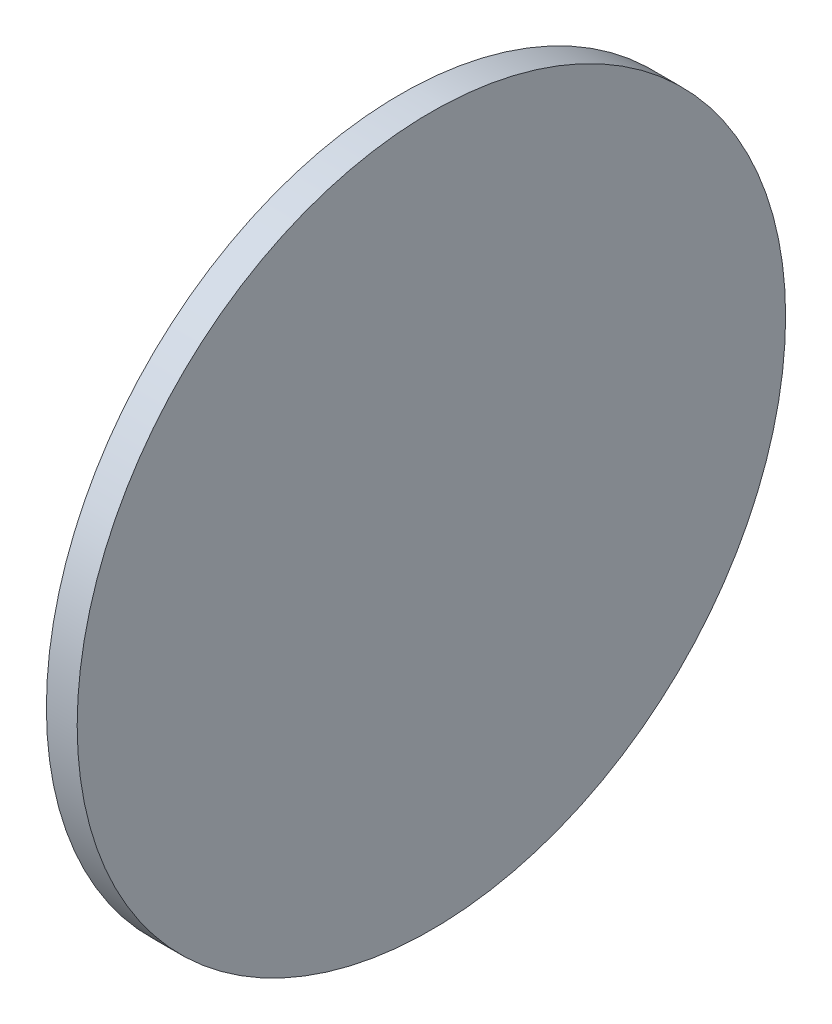
ISO-10303-21;
HEADER;
FILE_DESCRIPTION(('STEP AP214'),'2;1');
FILE_NAME('part.step','',(''),(''),'','','');
FILE_SCHEMA(('AUTOMOTIVE_DESIGN { 1 0 10303 214 1 1 1 1 }'));
ENDSEC;
DATA;
#1=APPLICATION_CONTEXT('core data for automotive mechanical design processes');
#2=APPLICATION_PROTOCOL_DEFINITION('international standard','automotive_design',2000,#1);
#3=PRODUCT_CONTEXT('',#1,'mechanical');
#4=PRODUCT('Part','Part','',(#3));
#5=PRODUCT_RELATED_PRODUCT_CATEGORY('part','',(#4));
#6=PRODUCT_DEFINITION_FORMATION('','',#4);
#7=PRODUCT_DEFINITION_CONTEXT('part definition',#1,'design');
#8=PRODUCT_DEFINITION('design','',#6,#7);
#9=PRODUCT_DEFINITION_SHAPE('','',#8);
#10=(LENGTH_UNIT() NAMED_UNIT(*) SI_UNIT(.MILLI.,.METRE.));
#11=(NAMED_UNIT(*) PLANE_ANGLE_UNIT() SI_UNIT($,.RADIAN.));
#12=(NAMED_UNIT(*) SI_UNIT($,.STERADIAN.) SOLID_ANGLE_UNIT());
#13=UNCERTAINTY_MEASURE_WITH_UNIT(LENGTH_MEASURE(1.E-05),#10,'distance_accuracy_value','');
#14=(GEOMETRIC_REPRESENTATION_CONTEXT(3) GLOBAL_UNCERTAINTY_ASSIGNED_CONTEXT((#13)) GLOBAL_UNIT_ASSIGNED_CONTEXT((#10,
#11,#12)) REPRESENTATION_CONTEXT('',''));
#15=CARTESIAN_POINT('',(0.,0.,0.));
#16=DIRECTION('',(0.,0.,1.));
#17=DIRECTION('',(1.,0.,0.));
#18=AXIS2_PLACEMENT_3D('',#15,#16,#17);
#19=CARTESIAN_POINT('',(0.,0.,0.));
#20=DIRECTION('',(1.,0.,0.));
#21=DIRECTION('',(0.,0.,-1.));
#22=AXIS2_PLACEMENT_3D('',#19,#20,#21);
#23=PLANE('',#22);
#24=CARTESIAN_POINT('',(0.,0.,0.));
#25=DIRECTION('',(-1.,0.,0.));
#26=DIRECTION('',(0.,0.,1.));
#27=AXIS2_PLACEMENT_3D('',#24,#25,#26);
#28=CIRCLE('',#27,1.4605);
#29=CARTESIAN_POINT('',(0.,0.,1.4605));
#30=VERTEX_POINT('',#29);
#31=EDGE_CURVE('E18',#30,#30,#28,.F.);
#32=ORIENTED_EDGE('',*,*,#31,.F.);
#33=EDGE_LOOP('',(#32));
#34=FACE_BOUND('',#33,.T.);
#35=ADVANCED_FACE('F15',(#34),#23,.F.);
#36=CARTESIAN_POINT('',(0.127,0.,0.));
#37=DIRECTION('',(-1.,0.,0.));
#38=DIRECTION('',(0.,0.,1.));
#39=AXIS2_PLACEMENT_3D('',#36,#37,#38);
#40=CYLINDRICAL_SURFACE('',#39,1.4605);
#41=ORIENTED_EDGE('',*,*,#31,.T.);
#42=EDGE_LOOP('',(#41));
#43=FACE_BOUND('',#42,.T.);
#44=CARTESIAN_POINT('',(0.127,0.,0.));
#45=DIRECTION('',(-1.,0.,0.));
#46=DIRECTION('',(0.,0.,1.));
#47=AXIS2_PLACEMENT_3D('',#44,#45,#46);
#48=CIRCLE('',#47,1.4605);
#49=CARTESIAN_POINT('',(0.127,0.,1.4605));
#50=VERTEX_POINT('',#49);
#51=EDGE_CURVE('E10',#50,#50,#48,.F.);
#52=ORIENTED_EDGE('',*,*,#51,.F.);
#53=EDGE_LOOP('',(#52));
#54=FACE_BOUND('',#53,.T.);
#55=ADVANCED_FACE('F27',(#43,#54),#40,.T.);
#56=CARTESIAN_POINT('',(0.127,0.,0.));
#57=DIRECTION('',(1.,0.,0.));
#58=DIRECTION('',(0.,0.,-1.));
#59=AXIS2_PLACEMENT_3D('',#56,#57,#58);
#60=PLANE('',#59);
#61=ORIENTED_EDGE('',*,*,#51,.T.);
#62=EDGE_LOOP('',(#61));
#63=FACE_BOUND('',#62,.T.);
#64=ADVANCED_FACE('F35',(#63),#60,.T.);
#65=CLOSED_SHELL('',(#35,#55,#64));
#66=MANIFOLD_SOLID_BREP('B1',#65);
#67=ADVANCED_BREP_SHAPE_REPRESENTATION('',(#18,#66),#14);
#68=SHAPE_DEFINITION_REPRESENTATION(#9,#67);
ENDSEC;
END-ISO-10303-21;
